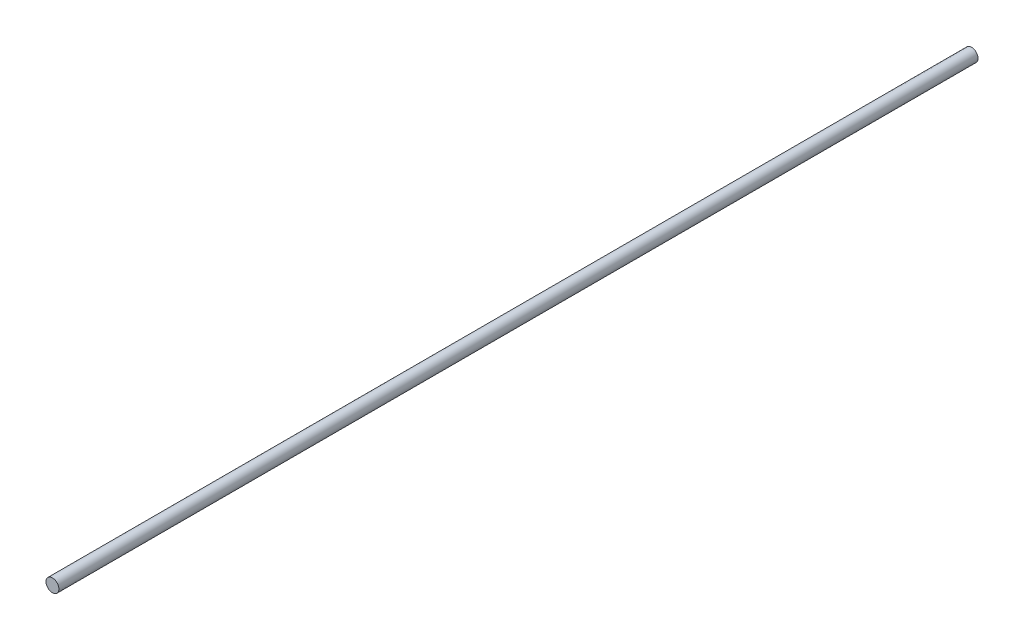
ISO-10303-21;
HEADER;
FILE_DESCRIPTION(('STEP AP214'),'2;1');
FILE_NAME('part.step','',(''),(''),'','','');
FILE_SCHEMA(('AUTOMOTIVE_DESIGN { 1 0 10303 214 1 1 1 1 }'));
ENDSEC;
DATA;
#1=APPLICATION_CONTEXT('core data for automotive mechanical design processes');
#2=APPLICATION_PROTOCOL_DEFINITION('international standard','automotive_design',2000,#1);
#3=PRODUCT_CONTEXT('',#1,'mechanical');
#4=PRODUCT('Part','Part','',(#3));
#5=PRODUCT_RELATED_PRODUCT_CATEGORY('part','',(#4));
#6=PRODUCT_DEFINITION_FORMATION('','',#4);
#7=PRODUCT_DEFINITION_CONTEXT('part definition',#1,'design');
#8=PRODUCT_DEFINITION('design','',#6,#7);
#9=PRODUCT_DEFINITION_SHAPE('','',#8);
#10=(LENGTH_UNIT() NAMED_UNIT(*) SI_UNIT(.MILLI.,.METRE.));
#11=(NAMED_UNIT(*) PLANE_ANGLE_UNIT() SI_UNIT($,.RADIAN.));
#12=(NAMED_UNIT(*) SI_UNIT($,.STERADIAN.) SOLID_ANGLE_UNIT());
#13=UNCERTAINTY_MEASURE_WITH_UNIT(LENGTH_MEASURE(1.E-05),#10,'distance_accuracy_value','');
#14=(GEOMETRIC_REPRESENTATION_CONTEXT(3) GLOBAL_UNCERTAINTY_ASSIGNED_CONTEXT((#13)) GLOBAL_UNIT_ASSIGNED_CONTEXT((#10,
#11,#12)) REPRESENTATION_CONTEXT('',''));
#15=CARTESIAN_POINT('',(0.,0.,0.));
#16=DIRECTION('',(0.,0.,1.));
#17=DIRECTION('',(1.,0.,0.));
#18=AXIS2_PLACEMENT_3D('',#15,#16,#17);
#19=CARTESIAN_POINT('',(0.,0.,570.));
#20=DIRECTION('',(0.,0.,-1.));
#21=DIRECTION('',(-1.,0.,0.));
#22=AXIS2_PLACEMENT_3D('',#19,#20,#21);
#23=CYLINDRICAL_SURFACE('',#22,4.);
#24=CARTESIAN_POINT('',(0.,0.,570.));
#25=DIRECTION('',(0.,0.,1.));
#26=DIRECTION('',(1.,0.,0.));
#27=AXIS2_PLACEMENT_3D('',#24,#25,#26);
#28=CIRCLE('',#27,4.);
#29=CARTESIAN_POINT('',(4.,0.,570.));
#30=VERTEX_POINT('',#29);
#31=EDGE_CURVE('E10',#30,#30,#28,.T.);
#32=ORIENTED_EDGE('',*,*,#31,.F.);
#33=EDGE_LOOP('',(#32));
#34=FACE_BOUND('',#33,.T.);
#35=CARTESIAN_POINT('',(0.,0.,0.));
#36=DIRECTION('',(0.,0.,1.));
#37=DIRECTION('',(1.,0.,0.));
#38=AXIS2_PLACEMENT_3D('',#35,#36,#37);
#39=CIRCLE('',#38,4.);
#40=CARTESIAN_POINT('',(4.,0.,0.));
#41=VERTEX_POINT('',#40);
#42=EDGE_CURVE('E36',#41,#41,#39,.T.);
#43=ORIENTED_EDGE('',*,*,#42,.T.);
#44=EDGE_LOOP('',(#43));
#45=FACE_BOUND('',#44,.T.);
#46=ADVANCED_FACE('F33',(#34,#45),#23,.T.);
#47=CARTESIAN_POINT('',(0.,0.,570.));
#48=DIRECTION('',(0.,0.,1.));
#49=DIRECTION('',(1.,0.,0.));
#50=AXIS2_PLACEMENT_3D('',#47,#48,#49);
#51=PLANE('',#50);
#52=ORIENTED_EDGE('',*,*,#31,.T.);
#53=EDGE_LOOP('',(#52));
#54=FACE_BOUND('',#53,.T.);
#55=ADVANCED_FACE('F48',(#54),#51,.T.);
#56=CARTESIAN_POINT('',(0.,0.,0.));
#57=DIRECTION('',(0.,0.,1.));
#58=DIRECTION('',(1.,0.,0.));
#59=AXIS2_PLACEMENT_3D('',#56,#57,#58);
#60=PLANE('',#59);
#61=ORIENTED_EDGE('',*,*,#42,.F.);
#62=EDGE_LOOP('',(#61));
#63=FACE_BOUND('',#62,.T.);
#64=ADVANCED_FACE('F46',(#63),#60,.F.);
#65=CLOSED_SHELL('',(#46,#55,#64));
#66=MANIFOLD_SOLID_BREP('B2',#65);
#67=ADVANCED_BREP_SHAPE_REPRESENTATION('',(#18,#66),#14);
#68=SHAPE_DEFINITION_REPRESENTATION(#9,#67);
ENDSEC;
END-ISO-10303-21;
